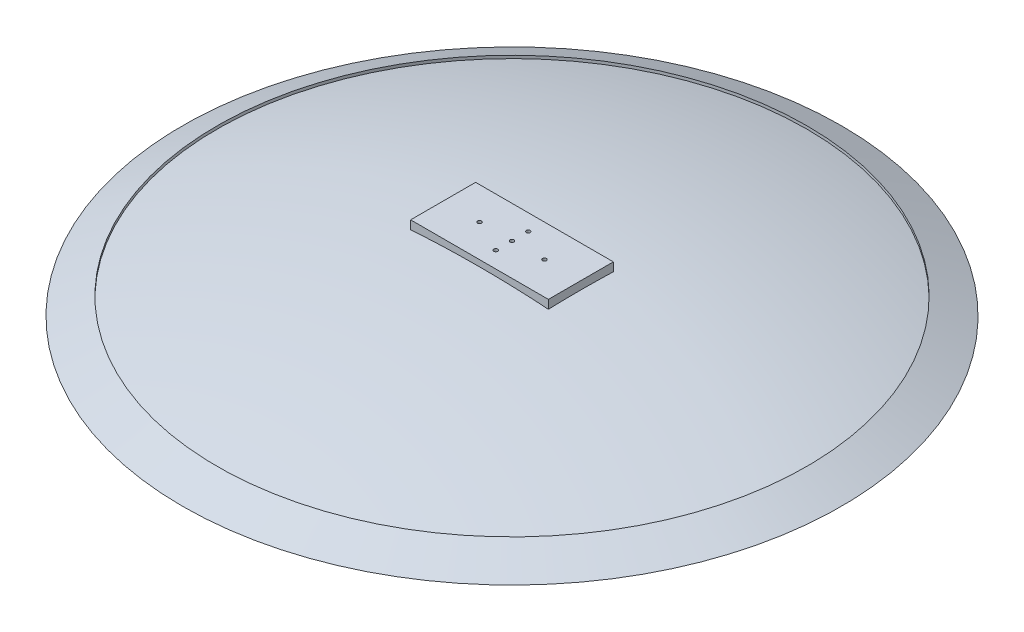
ISO-10303-21;
HEADER;
FILE_DESCRIPTION(('STEP AP214'),'2;1');
FILE_NAME('part.step','',(''),(''),'','','');
FILE_SCHEMA(('AUTOMOTIVE_DESIGN { 1 0 10303 214 1 1 1 1 }'));
ENDSEC;
DATA;
#1=APPLICATION_CONTEXT('core data for automotive mechanical design processes');
#2=APPLICATION_PROTOCOL_DEFINITION('international standard','automotive_design',2000,#1);
#3=PRODUCT_CONTEXT('',#1,'mechanical');
#4=PRODUCT('Part','Part','',(#3));
#5=PRODUCT_RELATED_PRODUCT_CATEGORY('part','',(#4));
#6=PRODUCT_DEFINITION_FORMATION('','',#4);
#7=PRODUCT_DEFINITION_CONTEXT('part definition',#1,'design');
#8=PRODUCT_DEFINITION('design','',#6,#7);
#9=PRODUCT_DEFINITION_SHAPE('','',#8);
#10=(LENGTH_UNIT() NAMED_UNIT(*) SI_UNIT(.MILLI.,.METRE.));
#11=(NAMED_UNIT(*) PLANE_ANGLE_UNIT() SI_UNIT($,.RADIAN.));
#12=(NAMED_UNIT(*) SI_UNIT($,.STERADIAN.) SOLID_ANGLE_UNIT());
#13=UNCERTAINTY_MEASURE_WITH_UNIT(LENGTH_MEASURE(1.E-05),#10,'distance_accuracy_value','');
#14=(GEOMETRIC_REPRESENTATION_CONTEXT(3) GLOBAL_UNCERTAINTY_ASSIGNED_CONTEXT((#13)) GLOBAL_UNIT_ASSIGNED_CONTEXT((#10,
#11,#12)) REPRESENTATION_CONTEXT('',''));
#15=CARTESIAN_POINT('',(0.,0.,0.));
#16=DIRECTION('',(0.,0.,1.));
#17=DIRECTION('',(1.,0.,0.));
#18=AXIS2_PLACEMENT_3D('',#15,#16,#17);
#19=CARTESIAN_POINT('',(446.,-1200.,0.));
#20=DIRECTION('',(0.,-1.,0.));
#21=DIRECTION('',(0.,0.,-1.));
#22=AXIS2_PLACEMENT_3D('',#19,#20,#21);
#23=DEGENERATE_TOROIDAL_SURFACE('',#22,4.,1500.,.T.);
#24=CARTESIAN_POINT('',(446.,230.908802125418,0.));
#25=DIRECTION('',(0.,-1.,0.));
#26=DIRECTION('',(0.,0.,-1.));
#27=AXIS2_PLACEMENT_3D('',#24,#25,#26);
#28=CIRCLE('',#27,454.);
#29=CARTESIAN_POINT('',(446.,230.908802125418,-454.));
#30=VERTEX_POINT('',#29);
#31=EDGE_CURVE('E193',#30,#30,#28,.T.);
#32=ORIENTED_EDGE('',*,*,#31,.F.);
#33=EDGE_LOOP('',(#32));
#34=FACE_BOUND('',#33,.T.);
#35=CARTESIAN_POINT('',(552.,289.187917731594,150.125121972504));
#36=CARTESIAN_POINT('',(552.,289.945104525548,142.447274197176));
#37=CARTESIAN_POINT('',(552.,290.643283557521,134.763614240469));
#38=CARTESIAN_POINT('',(552.,291.921906140958,119.386522475906));
#39=CARTESIAN_POINT('',(552.,292.502349982811,111.693090692199));
#40=CARTESIAN_POINT('',(552.,293.545796974926,96.298107406165));
#41=CARTESIAN_POINT('',(552.,294.008797645847,88.5965557358659));
#42=CARTESIAN_POINT('',(552.,294.817870496084,73.1873179520468));
#43=CARTESIAN_POINT('',(552.,295.163942699205,65.479631839776));
#44=CARTESIAN_POINT('',(552.,295.739032775516,50.0825096246962));
#45=CARTESIAN_POINT('',(552.,295.968390586044,42.3930862048358));
#46=CARTESIAN_POINT('',(552.,296.312366623516,27.0116578269807));
#47=CARTESIAN_POINT('',(552.,296.426984544032,19.3196528621465));
#48=CARTESIAN_POINT('',(552.,296.542037336551,3.93502044419523));
#49=CARTESIAN_POINT('',(552.,296.542475690283,-3.75760698278765));
#50=CARTESIAN_POINT('',(552.,296.429181692843,-19.1419340299471));
#51=CARTESIAN_POINT('',(552.,296.315450388764,-26.8336336579858));
#52=CARTESIAN_POINT('',(552.,295.929841841745,-44.1661240825519));
#53=CARTESIAN_POINT('',(552.,295.625156574755,-53.8062053822425));
#54=CARTESIAN_POINT('',(552.,294.833902355524,-73.0785531496938));
#55=CARTESIAN_POINT('',(552.,294.347339314762,-82.7108198612519));
#56=CARTESIAN_POINT('',(552.,293.189974939843,-101.982129156548));
#57=CARTESIAN_POINT('',(552.,292.518836594402,-111.621151650263));
#58=CARTESIAN_POINT('',(552.,291.373676264647,-126.068777477404));
#59=CARTESIAN_POINT('',(552.,290.968868543773,-130.882957940938));
#60=CARTESIAN_POINT('',(552.,290.113054397858,-140.507215900032));
#61=CARTESIAN_POINT('',(552.,289.66204792257,-145.317293391123));
#62=CARTESIAN_POINT('',(552.,289.187917731594,-150.125121972504));
#63=B_SPLINE_CURVE_WITH_KNOTS('',3,(#35,#36,#37,#38,#39,#40,#41,#42,#43,#44,#45,#46,#47,#48,#49,
#50,#51,#52,#53,#54,#55,#56,#57,#58,#59,#60,#61,#62),.UNSPECIFIED.,.F.,.F.,(4,2,2,2,2,2,2,2,2,2,
2,2,2,4),(0.,23.1450444861839,46.2900318854834,69.4355078576585,92.5809791176137,
115.658646391684,138.736375297648,161.81340048398,184.890214024401,213.823123822395,
242.755093310872,271.740243728431,286.233561436102,300.726894907714),.UNSPECIFIED.);
#64=CARTESIAN_POINT('',(552.,295.722435968898,50.));
#65=VERTEX_POINT('',#64);
#66=CARTESIAN_POINT('',(552.,295.722435968898,-50.));
#67=VERTEX_POINT('',#66);
#68=EDGE_CURVE('E11',#65,#67,#63,.T.);
#69=ORIENTED_EDGE('',*,*,#68,.F.);
#70=CARTESIAN_POINT('',(127.940845932976,265.912035749382,50.));
#71=CARTESIAN_POINT('',(134.507368468137,267.319074618453,50.));
#72=CARTESIAN_POINT('',(141.083261798482,268.681986140304,50.));
#73=CARTESIAN_POINT('',(154.252762646407,271.319353001023,50.));
#74=CARTESIAN_POINT('',(160.846370163099,272.593808344331,50.));
#75=CARTESIAN_POINT('',(180.651879133926,276.284123843443,50.));
#76=CARTESIAN_POINT('',(193.888810010599,278.567006962921,50.));
#77=CARTESIAN_POINT('',(220.415741638546,282.77590815481,50.));
#78=CARTESIAN_POINT('',(233.705728370599,284.702014850374,50.));
#79=CARTESIAN_POINT('',(260.332632415995,288.19688478845,50.));
#80=CARTESIAN_POINT('',(273.669549821354,289.765647329917,50.));
#81=CARTESIAN_POINT('',(300.237121789121,292.530066194274,50.));
#82=CARTESIAN_POINT('',(313.467375995185,293.729554814445,50.));
#83=CARTESIAN_POINT('',(333.33266581885,295.265893081559,50.));
#84=CARTESIAN_POINT('',(339.957786689746,295.73419206594,50.));
#85=CARTESIAN_POINT('',(353.213673040539,296.583332134485,50.));
#86=CARTESIAN_POINT('',(359.844438519877,296.964173227323,50.));
#87=CARTESIAN_POINT('',(373.11097328978,297.638762196505,50.));
#88=CARTESIAN_POINT('',(379.746742971025,297.932502367201,50.));
#89=CARTESIAN_POINT('',(393.021533762235,298.433570928028,50.));
#90=CARTESIAN_POINT('',(399.66055487042,298.640899365384,50.));
#91=CARTESIAN_POINT('',(412.94082536042,298.970626814008,50.));
#92=CARTESIAN_POINT('',(419.582074777285,299.093024419988,50.));
#93=CARTESIAN_POINT('',(429.544667657793,299.214673502054,50.));
#94=CARTESIAN_POINT('',(432.865663451759,299.244898638951,50.));
#95=CARTESIAN_POINT('',(439.507782887905,299.284961699475,50.));
#96=CARTESIAN_POINT('',(442.828906530098,299.294799620973,50.));
#97=CARTESIAN_POINT('',(449.468061685167,299.294188365542,50.));
#98=CARTESIAN_POINT('',(452.786093199791,299.283758056902,50.));
#99=CARTESIAN_POINT('',(459.422024923605,299.24254239757,50.));
#100=CARTESIAN_POINT('',(462.739925132809,299.211757049192,50.));
#101=CARTESIAN_POINT('',(472.693226139373,299.088471894516,50.));
#102=CARTESIAN_POINT('',(479.328274307098,298.965042980717,50.));
#103=CARTESIAN_POINT('',(492.596130370619,298.633384748825,50.));
#104=CARTESIAN_POINT('',(499.228938301955,298.425156845993,50.));
#105=CARTESIAN_POINT('',(512.491294695626,297.922437907492,50.));
#106=CARTESIAN_POINT('',(519.120843156078,297.627946822067,50.));
#107=CARTESIAN_POINT('',(532.374927040251,296.952012857224,50.));
#108=CARTESIAN_POINT('',(538.999462857718,296.570577721059,50.));
#109=CARTESIAN_POINT('',(552.242888144212,295.720410111058,50.));
#110=CARTESIAN_POINT('',(558.861777612763,295.251677629854,50.));
#111=CARTESIAN_POINT('',(578.708376622181,293.714282492241,50.));
#112=CARTESIAN_POINT('',(591.926173016983,292.514414185925,50.));
#113=CARTESIAN_POINT('',(618.468591712315,289.749903971711,50.));
#114=CARTESIAN_POINT('',(631.792814393273,288.18144054303,50.));
#115=CARTESIAN_POINT('',(658.394389410096,284.687844300298,50.));
#116=CARTESIAN_POINT('',(671.671741840532,282.762712206332,50.));
#117=CARTESIAN_POINT('',(698.173493930699,278.556432821891,50.));
#118=CARTESIAN_POINT('',(711.397879574709,276.275196959655,50.));
#119=CARTESIAN_POINT('',(731.184658670073,272.587853792195,50.));
#120=CARTESIAN_POINT('',(737.772037587943,271.314472793813,50.));
#121=CARTESIAN_POINT('',(750.929113441487,268.679421224401,50.));
#122=CARTESIAN_POINT('',(757.498810376273,267.317750648937,50.));
#123=CARTESIAN_POINT('',(764.059154067024,265.912035749382,50.));
#124=B_SPLINE_CURVE_WITH_KNOTS('',3,(#70,#71,#72,#73,#74,#75,#76,#77,#78,#79,#80,#81,#82,#83,
#84,#85,#86,#87,#88,#89,#90,#91,#92,#93,#94,#95,#96,#97,#98,#99,#100,#101,#102,#103,#104,#105,
#106,#107,#108,#109,#110,#111,#112,#113,#114,#115,#116,#117,#118,#119,#120,#121,#122,#123),
.UNSPECIFIED.,.F.,.F.,(4,2,2,2,2,2,2,2,2,2,2,2,2,2,2,2,2,2,2,2,2,2,2,2,2,2,4),(0.,
20.1464146469747,40.2928282826843,80.5846035368877,120.866356865425,161.148189218798,
200.996671918777,220.921150562944,240.845627231089,260.771866053147,280.698093985377,
300.624651614542,310.588000671894,320.551350769093,330.505430134978,340.459508369083,
360.367523872692,380.275207133105,400.182901876278,420.088824329154,439.994748462147,
479.806127517616,520.050045208524,560.293881651042,600.547743720926,620.675200953389,
640.802659196638),.UNSPECIFIED.);
#125=CARTESIAN_POINT('',(340.,295.722435968898,50.));
#126=VERTEX_POINT('',#125);
#127=EDGE_CURVE('E119',#126,#65,#124,.T.);
#128=ORIENTED_EDGE('',*,*,#127,.F.);
#129=CARTESIAN_POINT('',(340.,289.187917731594,-150.125121972504));
#130=CARTESIAN_POINT('',(340.,289.945104525548,-142.447274197176));
#131=CARTESIAN_POINT('',(340.,290.643283557521,-134.763614240469));
#132=CARTESIAN_POINT('',(340.,291.921906140958,-119.386522475906));
#133=CARTESIAN_POINT('',(340.,292.502349982811,-111.693090692199));
#134=CARTESIAN_POINT('',(340.,293.545796974926,-96.298107406165));
#135=CARTESIAN_POINT('',(340.,294.008797645847,-88.5965557358659));
#136=CARTESIAN_POINT('',(340.,294.817870496084,-73.1873179520469));
#137=CARTESIAN_POINT('',(340.,295.163942699205,-65.4796318397761));
#138=CARTESIAN_POINT('',(340.,295.739032775516,-50.0825096246962));
#139=CARTESIAN_POINT('',(340.,295.968390586044,-42.3930862048358));
#140=CARTESIAN_POINT('',(340.,296.312366623516,-27.0116578269808));
#141=CARTESIAN_POINT('',(340.,296.426984544032,-19.3196528621466));
#142=CARTESIAN_POINT('',(340.,296.542037336551,-3.93502044419526));
#143=CARTESIAN_POINT('',(340.,296.542475690283,3.75760698278762));
#144=CARTESIAN_POINT('',(340.,296.429181692843,19.1419340299471));
#145=CARTESIAN_POINT('',(340.,296.315450388764,26.8336336579858));
#146=CARTESIAN_POINT('',(340.,295.929841841745,44.1661240825519));
#147=CARTESIAN_POINT('',(340.,295.625156574755,53.8062053822424));
#148=CARTESIAN_POINT('',(340.,294.833902355524,73.0785531496938));
#149=CARTESIAN_POINT('',(340.,294.347339314762,82.7108198612518));
#150=CARTESIAN_POINT('',(340.,293.189974939844,101.982129156548));
#151=CARTESIAN_POINT('',(340.,292.518836594402,111.621151650263));
#152=CARTESIAN_POINT('',(340.,291.373676264647,126.068777477404));
#153=CARTESIAN_POINT('',(340.,290.968868543773,130.882957940938));
#154=CARTESIAN_POINT('',(340.,290.113054397859,140.507215900032));
#155=CARTESIAN_POINT('',(340.,289.66204792257,145.317293391123));
#156=CARTESIAN_POINT('',(340.,289.187917731594,150.125121972504));
#157=B_SPLINE_CURVE_WITH_KNOTS('',3,(#129,#130,#131,#132,#133,#134,#135,#136,#137,#138,#139,
#140,#141,#142,#143,#144,#145,#146,#147,#148,#149,#150,#151,#152,#153,#154,#155,#156),
.UNSPECIFIED.,.F.,.F.,(4,2,2,2,2,2,2,2,2,2,2,2,2,4),(0.,23.1450444861839,46.2900318854834,
69.4355078576585,92.5809791176137,115.658646391684,138.736375297648,161.81340048398,
184.890214024401,213.823123822395,242.755093310872,271.740243728431,286.233561436102,
300.726894907714),.UNSPECIFIED.);
#158=CARTESIAN_POINT('',(340.,295.722435968898,-50.0000000000002));
#159=VERTEX_POINT('',#158);
#160=EDGE_CURVE('E53',#159,#126,#157,.T.);
#161=ORIENTED_EDGE('',*,*,#160,.F.);
#162=CARTESIAN_POINT('',(764.059154067024,265.912035749382,-50.));
#163=CARTESIAN_POINT('',(757.492631531863,267.319074618453,-50.));
#164=CARTESIAN_POINT('',(750.916738201518,268.681986140303,-50.));
#165=CARTESIAN_POINT('',(737.747237353593,271.319353001023,-50.));
#166=CARTESIAN_POINT('',(731.153629836901,272.593808344331,-50.));
#167=CARTESIAN_POINT('',(711.348120866075,276.284123843443,-50.));
#168=CARTESIAN_POINT('',(698.111189989401,278.567006962921,-50.));
#169=CARTESIAN_POINT('',(671.584258361455,282.77590815481,-50.));
#170=CARTESIAN_POINT('',(658.294271629401,284.702014850374,-50.));
#171=CARTESIAN_POINT('',(631.667367584005,288.19688478845,-50.));
#172=CARTESIAN_POINT('',(618.330450178646,289.765647329917,-50.));
#173=CARTESIAN_POINT('',(591.762878210879,292.530066194274,-50.));
#174=CARTESIAN_POINT('',(578.532624004815,293.729554814446,-50.));
#175=CARTESIAN_POINT('',(558.667334181149,295.265893081559,-50.));
#176=CARTESIAN_POINT('',(552.042213310254,295.73419206594,-50.));
#177=CARTESIAN_POINT('',(538.786326959461,296.583332134485,-50.));
#178=CARTESIAN_POINT('',(532.155561480123,296.964173227323,-50.));
#179=CARTESIAN_POINT('',(518.88902671022,297.638762196505,-50.));
#180=CARTESIAN_POINT('',(512.253257028975,297.932502367201,-50.));
#181=CARTESIAN_POINT('',(498.978466237765,298.433570928028,-50.));
#182=CARTESIAN_POINT('',(492.33944512958,298.640899365384,-50.));
#183=CARTESIAN_POINT('',(479.05917463958,298.970626814008,-50.));
#184=CARTESIAN_POINT('',(472.417925222715,299.093024419988,-50.));
#185=CARTESIAN_POINT('',(462.455332342207,299.214673502054,-50.));
#186=CARTESIAN_POINT('',(459.134336548241,299.244898638951,-50.));
#187=CARTESIAN_POINT('',(452.492217112095,299.284961699475,-50.));
#188=CARTESIAN_POINT('',(449.171093469902,299.294799620973,-50.));
#189=CARTESIAN_POINT('',(442.531938314833,299.294188365542,-50.));
#190=CARTESIAN_POINT('',(439.213906800209,299.283758056902,-50.));
#191=CARTESIAN_POINT('',(432.577975076395,299.24254239757,-50.));
#192=CARTESIAN_POINT('',(429.260074867191,299.211757049192,-50.));
#193=CARTESIAN_POINT('',(419.306773860627,299.088471894516,-50.));
#194=CARTESIAN_POINT('',(412.671725692902,298.965042980718,-50.));
#195=CARTESIAN_POINT('',(399.403869629381,298.633384748825,-50.));
#196=CARTESIAN_POINT('',(392.771061698045,298.425156845993,-50.));
#197=CARTESIAN_POINT('',(379.508705304374,297.922437907492,-50.));
#198=CARTESIAN_POINT('',(372.879156843922,297.627946822067,-50.));
#199=CARTESIAN_POINT('',(359.625072959749,296.952012857224,-50.));
#200=CARTESIAN_POINT('',(353.000537142282,296.570577721059,-50.));
#201=CARTESIAN_POINT('',(339.757111855788,295.720410111058,-50.));
#202=CARTESIAN_POINT('',(333.138222387237,295.251677629854,-50.));
#203=CARTESIAN_POINT('',(313.291623377819,293.714282492241,-50.));
#204=CARTESIAN_POINT('',(300.073826983017,292.514414185925,-50.));
#205=CARTESIAN_POINT('',(273.531408287685,289.749903971711,-50.));
#206=CARTESIAN_POINT('',(260.207185606727,288.18144054303,-50.));
#207=CARTESIAN_POINT('',(233.605610589904,284.687844300298,-50.));
#208=CARTESIAN_POINT('',(220.328258159468,282.762712206332,-50.));
#209=CARTESIAN_POINT('',(193.826506069301,278.556432821891,-50.));
#210=CARTESIAN_POINT('',(180.602120425291,276.275196959655,-50.));
#211=CARTESIAN_POINT('',(160.815341329927,272.587853792195,-50.));
#212=CARTESIAN_POINT('',(154.227962412057,271.314472793813,-50.));
#213=CARTESIAN_POINT('',(141.070886558513,268.679421224401,-50.));
#214=CARTESIAN_POINT('',(134.501189623727,267.317750648937,-50.));
#215=CARTESIAN_POINT('',(127.940845932976,265.912035749382,-50.));
#216=B_SPLINE_CURVE_WITH_KNOTS('',3,(#162,#163,#164,#165,#166,#167,#168,#169,#170,#171,#172,
#173,#174,#175,#176,#177,#178,#179,#180,#181,#182,#183,#184,#185,#186,#187,#188,#189,#190,#191,
#192,#193,#194,#195,#196,#197,#198,#199,#200,#201,#202,#203,#204,#205,#206,#207,#208,#209,#210,
#211,#212,#213,#214,#215),.UNSPECIFIED.,.F.,.F.,(4,2,2,2,2,2,2,2,2,2,2,2,2,2,2,2,2,2,2,2,2,2,2,
2,2,2,4),(0.,20.1464146469747,40.2928282826842,80.5846035368877,120.866356865425,
161.148189218798,200.996671918778,220.921150562944,240.845627231089,260.771866053147,
280.698093985377,300.624651614542,310.588000671894,320.551350769093,330.505430134978,
340.459508369083,360.367523872692,380.275207133105,400.182901876278,420.088824329154,
439.994748462146,479.806127517616,520.050045208524,560.293881651042,600.547743720926,
620.675200953389,640.802659196638),.UNSPECIFIED.);
#217=EDGE_CURVE('E60',#67,#159,#216,.T.);
#218=ORIENTED_EDGE('',*,*,#217,.F.);
#219=EDGE_LOOP('',(#69,#128,#161,#218));
#220=FACE_BOUND('',#219,.T.);
#221=ADVANCED_FACE('F39',(#34,#220),#23,.T.);
#222=CARTESIAN_POINT('',(446.,295.994652396859,0.));
#223=DIRECTION('',(0.,-1.,0.));
#224=DIRECTION('',(0.,0.,-1.));
#225=AXIS2_PLACEMENT_3D('',#222,#223,#224);
#226=CYLINDRICAL_SURFACE('',#225,454.);
#227=CARTESIAN_POINT('',(446.,235.378919011157,0.));
#228=DIRECTION('',(0.,-1.,0.));
#229=DIRECTION('',(0.,0.,-1.));
#230=AXIS2_PLACEMENT_3D('',#227,#228,#229);
#231=CIRCLE('',#230,454.);
#232=CARTESIAN_POINT('',(446.,235.378919011157,-454.));
#233=VERTEX_POINT('',#232);
#234=EDGE_CURVE('E190',#233,#233,#231,.T.);
#235=ORIENTED_EDGE('',*,*,#234,.F.);
#236=EDGE_LOOP('',(#235));
#237=FACE_BOUND('',#236,.T.);
#238=ORIENTED_EDGE('',*,*,#31,.T.);
#239=EDGE_LOOP('',(#238));
#240=FACE_BOUND('',#239,.T.);
#241=ADVANCED_FACE('F179',(#237,#240),#226,.F.);
#242=CARTESIAN_POINT('',(446.,235.378919011157,0.));
#243=DIRECTION('',(0.,-1.,0.));
#244=DIRECTION('',(0.,0.,-1.));
#245=AXIS2_PLACEMENT_3D('',#242,#243,#244);
#246=CONICAL_SURFACE('',#245,454.,1.10805289853177);
#247=CARTESIAN_POINT('',(446.,208.811996197891,0.));
#248=DIRECTION('',(0.,-1.,0.));
#249=DIRECTION('',(0.,0.,-1.));
#250=AXIS2_PLACEMENT_3D('',#247,#248,#249);
#251=CIRCLE('',#250,507.254169748165);
#252=CARTESIAN_POINT('',(446.,208.811996197891,-507.254169748165));
#253=VERTEX_POINT('',#252);
#254=EDGE_CURVE('E199',#253,#253,#251,.T.);
#255=ORIENTED_EDGE('',*,*,#254,.F.);
#256=EDGE_LOOP('',(#255));
#257=FACE_BOUND('',#256,.T.);
#258=ORIENTED_EDGE('',*,*,#234,.T.);
#259=EDGE_LOOP('',(#258));
#260=FACE_BOUND('',#259,.T.);
#261=ADVANCED_FACE('F174',(#257,#260),#246,.T.);
#262=CARTESIAN_POINT('',(446.,-1200.,0.));
#263=DIRECTION('',(0.,-1.,0.));
#264=DIRECTION('',(0.,0.,-1.));
#265=AXIS2_PLACEMENT_3D('',#262,#263,#264);
#266=DEGENERATE_TOROIDAL_SURFACE('',#265,4.,1496.,.T.);
#267=CARTESIAN_POINT('',(446.,295.,0.));
#268=DIRECTION('',(0.,-1.,0.));
#269=DIRECTION('',(0.,0.,-1.));
#270=AXIS2_PLACEMENT_3D('',#267,#268,#269);
#271=CIRCLE('',#270,58.690035655503);
#272=CARTESIAN_POINT('',(476.733048746334,295.,-50.));
#273=VERTEX_POINT('',#272);
#274=CARTESIAN_POINT('',(476.733048746361,294.999999999999,50.));
#275=VERTEX_POINT('',#274);
#276=EDGE_CURVE('E198',#273,#275,#271,.T.);
#277=ORIENTED_EDGE('',*,*,#276,.F.);
#278=CARTESIAN_POINT('',(764.002558477447,261.83092304539,-50.));
#279=CARTESIAN_POINT('',(757.437511406544,263.241318928569,-50.));
#280=CARTESIAN_POINT('',(750.863047072719,264.607484065707,-50.));
#281=CARTESIAN_POINT('',(737.696316343441,267.251149810109,-50.));
#282=CARTESIAN_POINT('',(731.104049948887,268.528650421851,-50.));
#283=CARTESIAN_POINT('',(711.302441769975,272.227786409168,-50.));
#284=CARTESIAN_POINT('',(698.067946354602,274.516129974244,-50.));
#285=CARTESIAN_POINT('',(671.54562299765,278.735095099477,-50.));
#286=CARTESIAN_POINT('',(658.257809220702,280.665805972934,-50.));
#287=CARTESIAN_POINT('',(631.635018411435,284.169023101597,-50.));
#288=CARTESIAN_POINT('',(618.300041286509,285.741528653044,-50.));
#289=CARTESIAN_POINT('',(591.736865295084,288.51245403605,-50.));
#290=CARTESIAN_POINT('',(578.50907077314,289.71473462197,-50.));
#291=CARTESIAN_POINT('',(558.647374071967,291.254648855676,-50.));
#292=CARTESIAN_POINT('',(552.023434656027,291.724037846357,-50.));
#293=CARTESIAN_POINT('',(538.769883894414,292.575154110423,-50.));
#294=CARTESIAN_POINT('',(532.140272549307,292.956881392534,-50.));
#295=CARTESIAN_POINT('',(518.876021986117,293.633039692061,-50.));
#296=CARTESIAN_POINT('',(512.241382373594,293.927462949061,-50.));
#297=CARTESIAN_POINT('',(498.968836002363,294.429695966466,-50.));
#298=CARTESIAN_POINT('',(492.33092924545,294.637505774407,-50.));
#299=CARTESIAN_POINT('',(479.052876702653,294.967997746446,-50.));
#300=CARTESIAN_POINT('',(472.412730881372,295.090678494921,-50.));
#301=CARTESIAN_POINT('',(462.451789939266,295.21260745219,-50.));
#302=CARTESIAN_POINT('',(459.131344159948,295.24290174104,-50.));
#303=CARTESIAN_POINT('',(452.490324142496,295.28305534921,-50.));
#304=CARTESIAN_POINT('',(449.169749904348,295.292914666387,-50.));
#305=CARTESIAN_POINT('',(442.531709755783,295.292298634308,-50.));
#306=CARTESIAN_POINT('',(439.21424384359,295.281842299699,-50.));
#307=CARTESIAN_POINT('',(432.579443970998,295.240527083272,-50.));
#308=CARTESIAN_POINT('',(429.262110010583,295.209668203784,-50.));
#309=CARTESIAN_POINT('',(419.310509697741,295.086090384146,-50.));
#310=CARTESIAN_POINT('',(412.676597698043,294.962370264851,-50.));
#311=CARTESIAN_POINT('',(399.411024850023,294.629932404686,-50.));
#312=CARTESIAN_POINT('',(392.779363965807,294.421216089536,-50.));
#313=CARTESIAN_POINT('',(379.519317467513,293.917319761118,-50.));
#314=CARTESIAN_POINT('',(372.890931855334,293.62213969775,-50.));
#315=CARTESIAN_POINT('',(359.639197824862,292.944625836702,-50.));
#316=CARTESIAN_POINT('',(353.015849009016,292.562299837528,-50.));
#317=CARTESIAN_POINT('',(339.77482506534,291.710147930856,-50.));
#318=CARTESIAN_POINT('',(333.15714993799,291.240322015956,-50.));
#319=CARTESIAN_POINT('',(313.314242676395,289.699342521064,-50.));
#320=CARTESIAN_POINT('',(300.098971689734,288.496679178076,-50.));
#321=CARTESIAN_POINT('',(273.561082881181,285.725661554663,-50.));
#322=CARTESIAN_POINT('',(260.238868655737,284.15345743535,-50.));
#323=CARTESIAN_POINT('',(233.641542594793,280.651523982258,-50.));
#324=CARTESIAN_POINT('',(220.366430664089,278.721795371538,-50.));
#325=CARTESIAN_POINT('',(193.869421010557,274.505472677768,-50.));
#326=CARTESIAN_POINT('',(180.647537448771,272.218789333686,-50.));
#327=CARTESIAN_POINT('',(160.864758157532,268.522649059239,-50.));
#328=CARTESIAN_POINT('',(154.278753212349,267.246231242006,-50.));
#329=CARTESIAN_POINT('',(141.124512842194,264.604898992714,-50.));
#330=CARTESIAN_POINT('',(134.55627741812,263.239984556183,-50.));
#331=CARTESIAN_POINT('',(127.997441522553,261.83092304539,-50.));
#332=B_SPLINE_CURVE_WITH_KNOTS('',3,(#278,#279,#280,#281,#282,#283,#284,#285,#286,#287,#288,
#289,#290,#291,#292,#293,#294,#295,#296,#297,#298,#299,#300,#301,#302,#303,#304,#305,#306,#307,
#308,#309,#310,#311,#312,#313,#314,#315,#316,#317,#318,#319,#320,#321,#322,#323,#324,#325,#326,
#327,#328,#329,#330,#331),.UNSPECIFIED.,.F.,.F.,(4,2,2,2,2,2,2,2,2,2,2,2,2,2,2,2,2,2,2,2,2,2,2,
2,2,2,4),(0.,20.1441978591714,40.2883947009232,80.5757312361325,120.852993019851,
161.130333934935,200.972200453523,220.893372120798,240.814541805125,260.73748174315,
280.660410746843,300.583671043333,310.545371768235,320.507073537204,330.459456038147,
340.411837402151,360.316458492865,380.220745718416,400.125044477279,420.027562741572,
439.930082689938,479.734651203602,519.973874713911,560.213016845112,600.462237447769,
620.587376514181,640.712516597519),.UNSPECIFIED.);
#333=CARTESIAN_POINT('',(415.266951253671,295.,-50.));
#334=VERTEX_POINT('',#333);
#335=EDGE_CURVE('E163',#273,#334,#332,.T.);
#336=ORIENTED_EDGE('',*,*,#335,.T.);
#337=CARTESIAN_POINT('',(415.266951253671,295.,50.));
#338=VERTEX_POINT('',#337);
#339=EDGE_CURVE('E164',#338,#334,#271,.T.);
#340=ORIENTED_EDGE('',*,*,#339,.F.);
#341=CARTESIAN_POINT('',(127.997441522553,261.83092304539,50.));
#342=CARTESIAN_POINT('',(134.562488593456,263.241318928569,50.));
#343=CARTESIAN_POINT('',(141.136952927281,264.607484065707,50.));
#344=CARTESIAN_POINT('',(154.303683656559,267.251149810109,50.));
#345=CARTESIAN_POINT('',(160.895950051113,268.528650421851,50.));
#346=CARTESIAN_POINT('',(180.697558230025,272.227786409168,50.));
#347=CARTESIAN_POINT('',(193.932053645399,274.516129974244,50.));
#348=CARTESIAN_POINT('',(220.45437700235,278.735095099477,50.));
#349=CARTESIAN_POINT('',(233.742190779298,280.665805972934,50.));
#350=CARTESIAN_POINT('',(260.364981588565,284.169023101597,50.));
#351=CARTESIAN_POINT('',(273.699958713492,285.741528653044,50.));
#352=CARTESIAN_POINT('',(300.263134704916,288.51245403605,50.));
#353=CARTESIAN_POINT('',(313.49092922686,289.71473462197,50.));
#354=CARTESIAN_POINT('',(333.352625928033,291.254648855676,50.));
#355=CARTESIAN_POINT('',(339.976565343974,291.724037846357,50.));
#356=CARTESIAN_POINT('',(353.230116105586,292.575154110423,50.));
#357=CARTESIAN_POINT('',(359.859727450693,292.956881392534,50.));
#358=CARTESIAN_POINT('',(373.123978013883,293.633039692061,50.));
#359=CARTESIAN_POINT('',(379.758617626406,293.927462949061,50.));
#360=CARTESIAN_POINT('',(393.031163997637,294.429695966466,50.));
#361=CARTESIAN_POINT('',(399.669070754549,294.637505774407,50.));
#362=CARTESIAN_POINT('',(412.947123297347,294.967997746445,50.));
#363=CARTESIAN_POINT('',(419.587269118628,295.090678494921,50.));
#364=CARTESIAN_POINT('',(429.548210060734,295.21260745219,50.));
#365=CARTESIAN_POINT('',(432.868655840052,295.24290174104,50.));
#366=CARTESIAN_POINT('',(439.509675857504,295.28305534921,50.));
#367=CARTESIAN_POINT('',(442.830250095652,295.292914666387,50.));
#368=CARTESIAN_POINT('',(449.468290244217,295.292298634308,50.));
#369=CARTESIAN_POINT('',(452.785756156409,295.281842299699,50.));
#370=CARTESIAN_POINT('',(459.420556029002,295.240527083272,50.));
#371=CARTESIAN_POINT('',(462.737889989417,295.209668203784,50.));
#372=CARTESIAN_POINT('',(472.689490302259,295.086090384145,50.));
#373=CARTESIAN_POINT('',(479.323402301957,294.962370264851,50.));
#374=CARTESIAN_POINT('',(492.588975149977,294.629932404686,50.));
#375=CARTESIAN_POINT('',(499.220636034192,294.421216089536,50.));
#376=CARTESIAN_POINT('',(512.480682532487,293.917319761118,50.));
#377=CARTESIAN_POINT('',(519.109068144666,293.62213969775,50.));
#378=CARTESIAN_POINT('',(532.360802175138,292.944625836702,50.));
#379=CARTESIAN_POINT('',(538.984150990984,292.562299837528,50.));
#380=CARTESIAN_POINT('',(552.22517493466,291.710147930856,50.));
#381=CARTESIAN_POINT('',(558.842850062009,291.240322015956,50.));
#382=CARTESIAN_POINT('',(578.685757323605,289.699342521064,50.));
#383=CARTESIAN_POINT('',(591.901028310266,288.496679178077,50.));
#384=CARTESIAN_POINT('',(618.43891711882,285.725661554663,50.));
#385=CARTESIAN_POINT('',(631.761131344263,284.15345743535,50.));
#386=CARTESIAN_POINT('',(658.358457405207,280.651523982258,50.));
#387=CARTESIAN_POINT('',(671.633569335911,278.721795371538,50.));
#388=CARTESIAN_POINT('',(698.130578989444,274.505472677768,50.));
#389=CARTESIAN_POINT('',(711.352462551229,272.218789333686,50.));
#390=CARTESIAN_POINT('',(731.135241842468,268.522649059239,50.));
#391=CARTESIAN_POINT('',(737.721246787651,267.246231242006,50.));
#392=CARTESIAN_POINT('',(750.875487157806,264.604898992714,50.));
#393=CARTESIAN_POINT('',(757.44372258188,263.239984556182,50.));
#394=CARTESIAN_POINT('',(764.002558477447,261.83092304539,50.));
#395=B_SPLINE_CURVE_WITH_KNOTS('',3,(#341,#342,#343,#344,#345,#346,#347,#348,#349,#350,#351,
#352,#353,#354,#355,#356,#357,#358,#359,#360,#361,#362,#363,#364,#365,#366,#367,#368,#369,#370,
#371,#372,#373,#374,#375,#376,#377,#378,#379,#380,#381,#382,#383,#384,#385,#386,#387,#388,#389,
#390,#391,#392,#393,#394),.UNSPECIFIED.,.F.,.F.,(4,2,2,2,2,2,2,2,2,2,2,2,2,2,2,2,2,2,2,2,2,2,2,
2,2,2,4),(0.,20.1441978591714,40.2883947009232,80.5757312361325,120.852993019851,
161.130333934935,200.972200453523,220.893372120798,240.814541805125,260.73748174315,
280.660410746843,300.583671043333,310.545371768235,320.507073537204,330.459456038147,
340.41183740215,360.316458492865,380.220745718415,400.125044477278,420.027562741572,
439.930082689938,479.734651203602,519.973874713911,560.213016845112,600.462237447769,
620.587376514181,640.712516597519),.UNSPECIFIED.);
#396=EDGE_CURVE('E154',#338,#275,#395,.T.);
#397=ORIENTED_EDGE('',*,*,#396,.T.);
#398=EDGE_LOOP('',(#277,#336,#340,#397));
#399=FACE_BOUND('',#398,.T.);
#400=ORIENTED_EDGE('',*,*,#254,.T.);
#401=EDGE_LOOP('',(#400));
#402=FACE_BOUND('',#401,.T.);
#403=ADVANCED_FACE('F170',(#399,#402),#266,.F.);
#404=CARTESIAN_POINT('',(0.,295.,0.));
#405=DIRECTION('',(0.,-1.,0.));
#406=DIRECTION('',(0.,0.,-1.));
#407=AXIS2_PLACEMENT_3D('',#404,#405,#406);
#408=PLANE('',#407);
#409=CARTESIAN_POINT('',(446.,295.,-25.));
#410=DIRECTION('',(0.,-1.,0.));
#411=DIRECTION('',(0.,0.,-1.));
#412=AXIS2_PLACEMENT_3D('',#409,#410,#411);
#413=CIRCLE('',#412,2.99999999999999);
#414=CARTESIAN_POINT('',(446.,295.,-28.));
#415=VERTEX_POINT('',#414);
#416=EDGE_CURVE('E219',#415,#415,#413,.T.);
#417=ORIENTED_EDGE('',*,*,#416,.F.);
#418=EDGE_LOOP('',(#417));
#419=FACE_BOUND('',#418,.T.);
#420=CARTESIAN_POINT('',(446.,295.,25.));
#421=DIRECTION('',(0.,-1.,0.));
#422=DIRECTION('',(0.,0.,-1.));
#423=AXIS2_PLACEMENT_3D('',#420,#421,#422);
#424=CIRCLE('',#423,2.99999999999999);
#425=CARTESIAN_POINT('',(446.,295.,22.));
#426=VERTEX_POINT('',#425);
#427=EDGE_CURVE('E265',#426,#426,#424,.T.);
#428=ORIENTED_EDGE('',*,*,#427,.F.);
#429=EDGE_LOOP('',(#428));
#430=FACE_BOUND('',#429,.T.);
#431=CARTESIAN_POINT('',(446.,295.,0.));
#432=DIRECTION('',(0.,-1.,0.));
#433=DIRECTION('',(0.,0.,-1.));
#434=AXIS2_PLACEMENT_3D('',#431,#432,#433);
#435=CIRCLE('',#434,2.99999999999999);
#436=CARTESIAN_POINT('',(446.,295.,-2.99999999999999));
#437=VERTEX_POINT('',#436);
#438=EDGE_CURVE('E269',#437,#437,#435,.T.);
#439=ORIENTED_EDGE('',*,*,#438,.F.);
#440=EDGE_LOOP('',(#439));
#441=FACE_BOUND('',#440,.T.);
#442=CARTESIAN_POINT('',(396.,295.,0.));
#443=DIRECTION('',(0.,-1.,0.));
#444=DIRECTION('',(0.,0.,-1.));
#445=AXIS2_PLACEMENT_3D('',#442,#443,#444);
#446=CIRCLE('',#445,2.99999999999999);
#447=CARTESIAN_POINT('',(396.,295.,-2.99999999999998));
#448=VERTEX_POINT('',#447);
#449=EDGE_CURVE('E273',#448,#448,#446,.T.);
#450=ORIENTED_EDGE('',*,*,#449,.F.);
#451=EDGE_LOOP('',(#450));
#452=FACE_BOUND('',#451,.T.);
#453=CARTESIAN_POINT('',(496.,295.,0.));
#454=DIRECTION('',(0.,-1.,0.));
#455=DIRECTION('',(0.,0.,-1.));
#456=AXIS2_PLACEMENT_3D('',#453,#454,#455);
#457=CIRCLE('',#456,2.99999999999999);
#458=CARTESIAN_POINT('',(496.,295.,-3.00000000000003));
#459=VERTEX_POINT('',#458);
#460=EDGE_CURVE('E276',#459,#459,#457,.T.);
#461=ORIENTED_EDGE('',*,*,#460,.F.);
#462=EDGE_LOOP('',(#461));
#463=FACE_BOUND('',#462,.T.);
#464=DIRECTION('',(-1.,0.,0.));
#465=VECTOR('',#464,1.);
#466=CARTESIAN_POINT('',(340.,295.,-50.));
#467=LINE('',#466,#465);
#468=EDGE_CURVE('E215',#273,#334,#467,.T.);
#469=ORIENTED_EDGE('',*,*,#468,.F.);
#470=ORIENTED_EDGE('',*,*,#276,.T.);
#471=DIRECTION('',(1.,0.,0.));
#472=VECTOR('',#471,1.);
#473=CARTESIAN_POINT('',(340.,295.,50.));
#474=LINE('',#473,#472);
#475=EDGE_CURVE('E115',#338,#275,#474,.T.);
#476=ORIENTED_EDGE('',*,*,#475,.F.);
#477=ORIENTED_EDGE('',*,*,#339,.T.);
#478=EDGE_LOOP('',(#469,#470,#476,#477));
#479=FACE_BOUND('',#478,.T.);
#480=ADVANCED_FACE('F146',(#419,#430,#441,#452,#463,#479),#408,.T.);
#481=CARTESIAN_POINT('',(340.,309.,50.));
#482=DIRECTION('',(0.,0.,-1.));
#483=DIRECTION('',(-1.,0.,0.));
#484=AXIS2_PLACEMENT_3D('',#481,#482,#483);
#485=PLANE('',#484);
#486=ORIENTED_EDGE('',*,*,#396,.F.);
#487=ORIENTED_EDGE('',*,*,#475,.T.);
#488=EDGE_LOOP('',(#486,#487));
#489=FACE_BOUND('',#488,.T.);
#490=ADVANCED_FACE('F140',(#489),#485,.F.);
#491=CARTESIAN_POINT('',(340.,309.,-50.));
#492=DIRECTION('',(0.,0.,1.));
#493=DIRECTION('',(1.,0.,0.));
#494=AXIS2_PLACEMENT_3D('',#491,#492,#493);
#495=PLANE('',#494);
#496=ORIENTED_EDGE('',*,*,#335,.F.);
#497=ORIENTED_EDGE('',*,*,#468,.T.);
#498=EDGE_LOOP('',(#496,#497));
#499=FACE_BOUND('',#498,.T.);
#500=ADVANCED_FACE('F145',(#499),#495,.F.);
#501=CARTESIAN_POINT('',(552.,309.,50.));
#502=DIRECTION('',(-1.,0.,0.));
#503=DIRECTION('',(0.,0.,1.));
#504=AXIS2_PLACEMENT_3D('',#501,#502,#503);
#505=PLANE('',#504);
#506=DIRECTION('',(0.,-1.,0.));
#507=VECTOR('',#506,1.);
#508=CARTESIAN_POINT('',(552.,309.,50.));
#509=LINE('',#508,#507);
#510=CARTESIAN_POINT('',(552.,309.,50.));
#511=VERTEX_POINT('',#510);
#512=EDGE_CURVE('E212',#511,#65,#509,.T.);
#513=ORIENTED_EDGE('',*,*,#512,.T.);
#514=ORIENTED_EDGE('',*,*,#68,.T.);
#515=DIRECTION('',(0.,-1.,0.));
#516=VECTOR('',#515,1.);
#517=CARTESIAN_POINT('',(552.,309.,-50.));
#518=LINE('',#517,#516);
#519=CARTESIAN_POINT('',(552.,309.,-50.));
#520=VERTEX_POINT('',#519);
#521=EDGE_CURVE('E98',#520,#67,#518,.T.);
#522=ORIENTED_EDGE('',*,*,#521,.F.);
#523=DIRECTION('',(0.,0.,-1.));
#524=VECTOR('',#523,1.);
#525=CARTESIAN_POINT('',(552.,309.,50.));
#526=LINE('',#525,#524);
#527=EDGE_CURVE('E105',#511,#520,#526,.T.);
#528=ORIENTED_EDGE('',*,*,#527,.F.);
#529=EDGE_LOOP('',(#513,#514,#522,#528));
#530=FACE_BOUND('',#529,.T.);
#531=ADVANCED_FACE('F117',(#530),#505,.F.);
#532=CARTESIAN_POINT('',(340.,309.,50.));
#533=DIRECTION('',(1.,0.,0.));
#534=DIRECTION('',(0.,0.,-1.));
#535=AXIS2_PLACEMENT_3D('',#532,#533,#534);
#536=PLANE('',#535);
#537=DIRECTION('',(0.,-1.,0.));
#538=VECTOR('',#537,1.);
#539=CARTESIAN_POINT('',(340.,309.,-50.));
#540=LINE('',#539,#538);
#541=CARTESIAN_POINT('',(340.,309.,-50.));
#542=VERTEX_POINT('',#541);
#543=EDGE_CURVE('E100',#542,#159,#540,.T.);
#544=ORIENTED_EDGE('',*,*,#543,.T.);
#545=ORIENTED_EDGE('',*,*,#160,.T.);
#546=DIRECTION('',(0.,-1.,0.));
#547=VECTOR('',#546,1.);
#548=CARTESIAN_POINT('',(340.,309.,50.));
#549=LINE('',#548,#547);
#550=CARTESIAN_POINT('',(340.,309.,50.));
#551=VERTEX_POINT('',#550);
#552=EDGE_CURVE('E125',#551,#126,#549,.T.);
#553=ORIENTED_EDGE('',*,*,#552,.F.);
#554=DIRECTION('',(0.,0.,1.));
#555=VECTOR('',#554,1.);
#556=CARTESIAN_POINT('',(340.,309.,50.));
#557=LINE('',#556,#555);
#558=EDGE_CURVE('E104',#542,#551,#557,.T.);
#559=ORIENTED_EDGE('',*,*,#558,.F.);
#560=EDGE_LOOP('',(#544,#545,#553,#559));
#561=FACE_BOUND('',#560,.T.);
#562=ADVANCED_FACE('F150',(#561),#536,.F.);
#563=ORIENTED_EDGE('',*,*,#521,.T.);
#564=ORIENTED_EDGE('',*,*,#217,.T.);
#565=ORIENTED_EDGE('',*,*,#543,.F.);
#566=DIRECTION('',(-1.,0.,0.));
#567=VECTOR('',#566,1.);
#568=CARTESIAN_POINT('',(340.,309.,-50.));
#569=LINE('',#568,#567);
#570=EDGE_CURVE('E94',#520,#542,#569,.T.);
#571=ORIENTED_EDGE('',*,*,#570,.F.);
#572=EDGE_LOOP('',(#563,#564,#565,#571));
#573=FACE_BOUND('',#572,.T.);
#574=ADVANCED_FACE('F96',(#573),#495,.F.);
#575=ORIENTED_EDGE('',*,*,#552,.T.);
#576=ORIENTED_EDGE('',*,*,#127,.T.);
#577=ORIENTED_EDGE('',*,*,#512,.F.);
#578=DIRECTION('',(1.,0.,0.));
#579=VECTOR('',#578,1.);
#580=CARTESIAN_POINT('',(340.,309.,50.));
#581=LINE('',#580,#579);
#582=EDGE_CURVE('E110',#551,#511,#581,.T.);
#583=ORIENTED_EDGE('',*,*,#582,.F.);
#584=EDGE_LOOP('',(#575,#576,#577,#583));
#585=FACE_BOUND('',#584,.T.);
#586=ADVANCED_FACE('F148',(#585),#485,.F.);
#587=CARTESIAN_POINT('',(0.,309.,0.));
#588=DIRECTION('',(0.,-1.,0.));
#589=DIRECTION('',(0.,0.,-1.));
#590=AXIS2_PLACEMENT_3D('',#587,#588,#589);
#591=PLANE('',#590);
#592=CARTESIAN_POINT('',(446.,309.,-25.));
#593=DIRECTION('',(0.,1.,0.));
#594=DIRECTION('',(0.,0.,1.));
#595=AXIS2_PLACEMENT_3D('',#592,#593,#594);
#596=CIRCLE('',#595,2.99999999999999);
#597=CARTESIAN_POINT('',(446.,309.,-22.));
#598=VERTEX_POINT('',#597);
#599=EDGE_CURVE('E279',#598,#598,#596,.T.);
#600=ORIENTED_EDGE('',*,*,#599,.F.);
#601=EDGE_LOOP('',(#600));
#602=FACE_BOUND('',#601,.T.);
#603=CARTESIAN_POINT('',(446.,309.,25.));
#604=DIRECTION('',(0.,1.,0.));
#605=DIRECTION('',(0.,0.,1.));
#606=AXIS2_PLACEMENT_3D('',#603,#604,#605);
#607=CIRCLE('',#606,2.99999999999999);
#608=CARTESIAN_POINT('',(446.,309.,28.));
#609=VERTEX_POINT('',#608);
#610=EDGE_CURVE('E307',#609,#609,#607,.T.);
#611=ORIENTED_EDGE('',*,*,#610,.F.);
#612=EDGE_LOOP('',(#611));
#613=FACE_BOUND('',#612,.T.);
#614=CARTESIAN_POINT('',(446.,309.,0.));
#615=DIRECTION('',(0.,1.,0.));
#616=DIRECTION('',(0.,0.,1.));
#617=AXIS2_PLACEMENT_3D('',#614,#615,#616);
#618=CIRCLE('',#617,2.99999999999999);
#619=CARTESIAN_POINT('',(446.,309.,2.99999999999999));
#620=VERTEX_POINT('',#619);
#621=EDGE_CURVE('E311',#620,#620,#618,.T.);
#622=ORIENTED_EDGE('',*,*,#621,.F.);
#623=EDGE_LOOP('',(#622));
#624=FACE_BOUND('',#623,.T.);
#625=CARTESIAN_POINT('',(396.,309.,0.));
#626=DIRECTION('',(0.,1.,0.));
#627=DIRECTION('',(0.,0.,1.));
#628=AXIS2_PLACEMENT_3D('',#625,#626,#627);
#629=CIRCLE('',#628,2.99999999999999);
#630=CARTESIAN_POINT('',(396.,309.,3.00000000000001));
#631=VERTEX_POINT('',#630);
#632=EDGE_CURVE('E288',#631,#631,#629,.T.);
#633=ORIENTED_EDGE('',*,*,#632,.F.);
#634=EDGE_LOOP('',(#633));
#635=FACE_BOUND('',#634,.T.);
#636=CARTESIAN_POINT('',(496.,309.,0.));
#637=DIRECTION('',(0.,1.,0.));
#638=DIRECTION('',(0.,0.,1.));
#639=AXIS2_PLACEMENT_3D('',#636,#637,#638);
#640=CIRCLE('',#639,2.99999999999999);
#641=CARTESIAN_POINT('',(496.,309.,2.99999999999996));
#642=VERTEX_POINT('',#641);
#643=EDGE_CURVE('E285',#642,#642,#640,.T.);
#644=ORIENTED_EDGE('',*,*,#643,.F.);
#645=EDGE_LOOP('',(#644));
#646=FACE_BOUND('',#645,.T.);
#647=ORIENTED_EDGE('',*,*,#527,.T.);
#648=ORIENTED_EDGE('',*,*,#570,.T.);
#649=ORIENTED_EDGE('',*,*,#558,.T.);
#650=ORIENTED_EDGE('',*,*,#582,.T.);
#651=EDGE_LOOP('',(#647,#648,#649,#650));
#652=FACE_BOUND('',#651,.T.);
#653=ADVANCED_FACE('F108',(#602,#613,#624,#635,#646,#652),#591,.F.);
#654=CARTESIAN_POINT('',(496.,285.,0.));
#655=DIRECTION('',(0.,1.,0.));
#656=DIRECTION('',(0.,0.,1.));
#657=AXIS2_PLACEMENT_3D('',#654,#655,#656);
#658=CYLINDRICAL_SURFACE('',#657,2.99999999999999);
#659=ORIENTED_EDGE('',*,*,#460,.T.);
#660=EDGE_LOOP('',(#659));
#661=FACE_BOUND('',#660,.T.);
#662=ORIENTED_EDGE('',*,*,#643,.T.);
#663=EDGE_LOOP('',(#662));
#664=FACE_BOUND('',#663,.T.);
#665=ADVANCED_FACE('F231',(#661,#664),#658,.F.);
#666=CARTESIAN_POINT('',(396.,285.,0.));
#667=DIRECTION('',(0.,1.,0.));
#668=DIRECTION('',(0.,0.,1.));
#669=AXIS2_PLACEMENT_3D('',#666,#667,#668);
#670=CYLINDRICAL_SURFACE('',#669,2.99999999999999);
#671=ORIENTED_EDGE('',*,*,#449,.T.);
#672=EDGE_LOOP('',(#671));
#673=FACE_BOUND('',#672,.T.);
#674=ORIENTED_EDGE('',*,*,#632,.T.);
#675=EDGE_LOOP('',(#674));
#676=FACE_BOUND('',#675,.T.);
#677=ADVANCED_FACE('F327',(#673,#676),#670,.F.);
#678=CARTESIAN_POINT('',(446.,285.,0.));
#679=DIRECTION('',(0.,1.,0.));
#680=DIRECTION('',(0.,0.,1.));
#681=AXIS2_PLACEMENT_3D('',#678,#679,#680);
#682=CYLINDRICAL_SURFACE('',#681,2.99999999999999);
#683=ORIENTED_EDGE('',*,*,#438,.T.);
#684=EDGE_LOOP('',(#683));
#685=FACE_BOUND('',#684,.T.);
#686=ORIENTED_EDGE('',*,*,#621,.T.);
#687=EDGE_LOOP('',(#686));
#688=FACE_BOUND('',#687,.T.);
#689=ADVANCED_FACE('F325',(#685,#688),#682,.F.);
#690=CARTESIAN_POINT('',(446.,285.,25.));
#691=DIRECTION('',(0.,1.,0.));
#692=DIRECTION('',(0.,0.,1.));
#693=AXIS2_PLACEMENT_3D('',#690,#691,#692);
#694=CYLINDRICAL_SURFACE('',#693,2.99999999999999);
#695=ORIENTED_EDGE('',*,*,#427,.T.);
#696=EDGE_LOOP('',(#695));
#697=FACE_BOUND('',#696,.T.);
#698=ORIENTED_EDGE('',*,*,#610,.T.);
#699=EDGE_LOOP('',(#698));
#700=FACE_BOUND('',#699,.T.);
#701=ADVANCED_FACE('F300',(#697,#700),#694,.F.);
#702=CARTESIAN_POINT('',(446.,285.,-25.));
#703=DIRECTION('',(0.,1.,0.));
#704=DIRECTION('',(0.,0.,1.));
#705=AXIS2_PLACEMENT_3D('',#702,#703,#704);
#706=CYLINDRICAL_SURFACE('',#705,2.99999999999999);
#707=ORIENTED_EDGE('',*,*,#416,.T.);
#708=EDGE_LOOP('',(#707));
#709=FACE_BOUND('',#708,.T.);
#710=ORIENTED_EDGE('',*,*,#599,.T.);
#711=EDGE_LOOP('',(#710));
#712=FACE_BOUND('',#711,.T.);
#713=ADVANCED_FACE('F297',(#709,#712),#706,.F.);
#714=CLOSED_SHELL('',(#221,#241,#261,#403,#480,#490,#500,#531,#562,#574,#586,#653,#665,#677,
#689,#701,#713));
#715=MANIFOLD_SOLID_BREP('B2',#714);
#716=ADVANCED_BREP_SHAPE_REPRESENTATION('',(#18,#715),#14);
#717=SHAPE_DEFINITION_REPRESENTATION(#9,#716);
ENDSEC;
END-ISO-10303-21;
